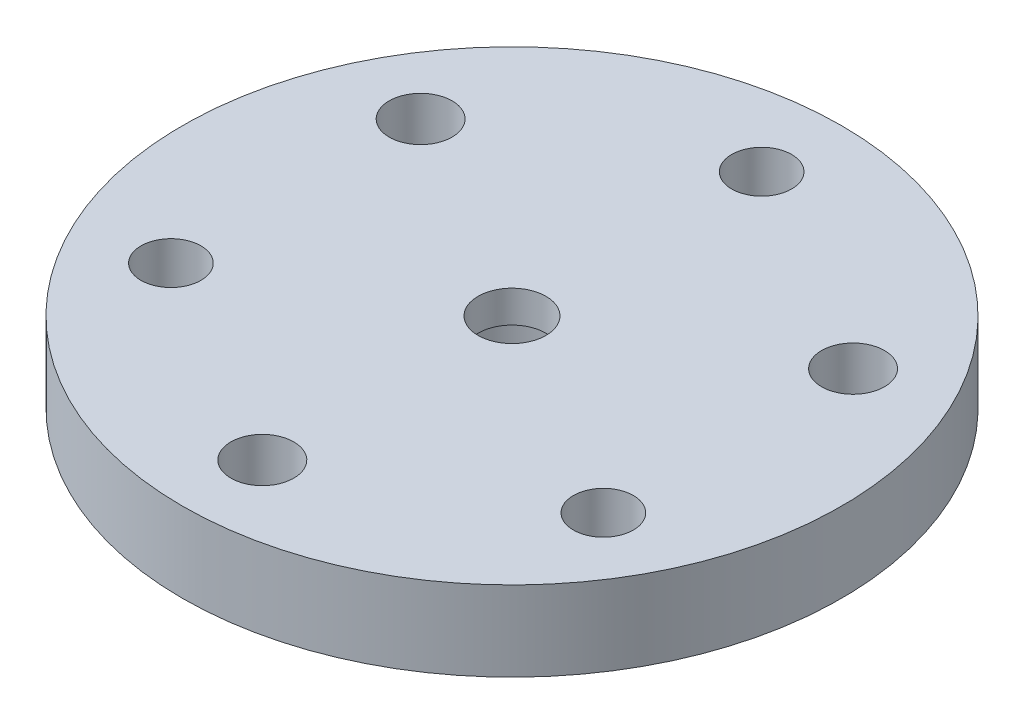
ISO-10303-21;
HEADER;
FILE_DESCRIPTION(('STEP AP214'),'2;1');
FILE_NAME('part.step','',(''),(''),'','','');
FILE_SCHEMA(('AUTOMOTIVE_DESIGN { 1 0 10303 214 1 1 1 1 }'));
ENDSEC;
DATA;
#1=APPLICATION_CONTEXT('core data for automotive mechanical design processes');
#2=APPLICATION_PROTOCOL_DEFINITION('international standard','automotive_design',2000,#1);
#3=PRODUCT_CONTEXT('',#1,'mechanical');
#4=PRODUCT('Part','Part','',(#3));
#5=PRODUCT_RELATED_PRODUCT_CATEGORY('part','',(#4));
#6=PRODUCT_DEFINITION_FORMATION('','',#4);
#7=PRODUCT_DEFINITION_CONTEXT('part definition',#1,'design');
#8=PRODUCT_DEFINITION('design','',#6,#7);
#9=PRODUCT_DEFINITION_SHAPE('','',#8);
#10=(LENGTH_UNIT() NAMED_UNIT(*) SI_UNIT(.MILLI.,.METRE.));
#11=(NAMED_UNIT(*) PLANE_ANGLE_UNIT() SI_UNIT($,.RADIAN.));
#12=(NAMED_UNIT(*) SI_UNIT($,.STERADIAN.) SOLID_ANGLE_UNIT());
#13=UNCERTAINTY_MEASURE_WITH_UNIT(LENGTH_MEASURE(1.E-05),#10,'distance_accuracy_value','');
#14=(GEOMETRIC_REPRESENTATION_CONTEXT(3) GLOBAL_UNCERTAINTY_ASSIGNED_CONTEXT((#13)) GLOBAL_UNIT_ASSIGNED_CONTEXT((#10,
#11,#12)) REPRESENTATION_CONTEXT('',''));
#15=CARTESIAN_POINT('',(0.,0.,0.));
#16=DIRECTION('',(0.,0.,1.));
#17=DIRECTION('',(1.,0.,0.));
#18=AXIS2_PLACEMENT_3D('',#15,#16,#17);
#19=CARTESIAN_POINT('',(0.,4.,0.));
#20=DIRECTION('',(0.,-1.,0.));
#21=DIRECTION('',(0.,0.,-1.));
#22=AXIS2_PLACEMENT_3D('',#19,#20,#21);
#23=CYLINDRICAL_SURFACE('',#22,16.5);
#24=CARTESIAN_POINT('',(0.,4.,0.));
#25=DIRECTION('',(0.,1.,0.));
#26=DIRECTION('',(0.,0.,1.));
#27=AXIS2_PLACEMENT_3D('',#24,#25,#26);
#28=CIRCLE('',#27,16.5);
#29=CARTESIAN_POINT('',(0.,4.,16.5));
#30=VERTEX_POINT('',#29);
#31=EDGE_CURVE('E10',#30,#30,#28,.T.);
#32=ORIENTED_EDGE('',*,*,#31,.F.);
#33=EDGE_LOOP('',(#32));
#34=FACE_BOUND('',#33,.T.);
#35=CARTESIAN_POINT('',(0.,0.,0.));
#36=DIRECTION('',(0.,1.,0.));
#37=DIRECTION('',(0.,0.,1.));
#38=AXIS2_PLACEMENT_3D('',#35,#36,#37);
#39=CIRCLE('',#38,16.5);
#40=CARTESIAN_POINT('',(0.,0.,16.5));
#41=VERTEX_POINT('',#40);
#42=EDGE_CURVE('E46',#41,#41,#39,.T.);
#43=ORIENTED_EDGE('',*,*,#42,.T.);
#44=EDGE_LOOP('',(#43));
#45=FACE_BOUND('',#44,.T.);
#46=ADVANCED_FACE('F43',(#34,#45),#23,.T.);
#47=CARTESIAN_POINT('',(0.,4.,0.));
#48=DIRECTION('',(0.,1.,0.));
#49=DIRECTION('',(0.,0.,1.));
#50=AXIS2_PLACEMENT_3D('',#47,#48,#49);
#51=PLANE('',#50);
#52=CARTESIAN_POINT('',(0.,4.,12.5));
#53=DIRECTION('',(0.,-1.,0.));
#54=DIRECTION('',(0.,0.,-1.));
#55=AXIS2_PLACEMENT_3D('',#52,#53,#54);
#56=CIRCLE('',#55,1.575);
#57=CARTESIAN_POINT('',(0.,4.,10.925));
#58=VERTEX_POINT('',#57);
#59=EDGE_CURVE('E112',#58,#58,#56,.T.);
#60=ORIENTED_EDGE('',*,*,#59,.T.);
#61=EDGE_LOOP('',(#60));
#62=FACE_BOUND('',#61,.T.);
#63=CARTESIAN_POINT('',(10.8253175473055,4.,-6.25000000000005));
#64=DIRECTION('',(0.,-1.,0.));
#65=DIRECTION('',(0.,0.,-1.));
#66=AXIS2_PLACEMENT_3D('',#63,#64,#65);
#67=CIRCLE('',#66,1.575);
#68=CARTESIAN_POINT('',(10.8253175473055,4.,-7.82500000000005));
#69=VERTEX_POINT('',#68);
#70=EDGE_CURVE('E104',#69,#69,#67,.T.);
#71=ORIENTED_EDGE('',*,*,#70,.T.);
#72=EDGE_LOOP('',(#71));
#73=FACE_BOUND('',#72,.T.);
#74=CARTESIAN_POINT('',(-10.8253175473055,4.,-6.2499999999999));
#75=DIRECTION('',(0.,-1.,0.));
#76=DIRECTION('',(0.,0.,-1.));
#77=AXIS2_PLACEMENT_3D('',#74,#75,#76);
#78=CIRCLE('',#77,1.575);
#79=CARTESIAN_POINT('',(-10.8253175473055,4.,-7.8249999999999));
#80=VERTEX_POINT('',#79);
#81=EDGE_CURVE('E96',#80,#80,#78,.T.);
#82=ORIENTED_EDGE('',*,*,#81,.T.);
#83=EDGE_LOOP('',(#82));
#84=FACE_BOUND('',#83,.T.);
#85=CARTESIAN_POINT('',(0.,4.,-12.5));
#86=DIRECTION('',(0.,1.,0.));
#87=DIRECTION('',(0.,0.,1.));
#88=AXIS2_PLACEMENT_3D('',#85,#86,#87);
#89=CIRCLE('',#88,1.5);
#90=CARTESIAN_POINT('',(0.,4.,-11.));
#91=VERTEX_POINT('',#90);
#92=EDGE_CURVE('E88',#91,#91,#89,.T.);
#93=ORIENTED_EDGE('',*,*,#92,.F.);
#94=EDGE_LOOP('',(#93));
#95=FACE_BOUND('',#94,.T.);
#96=CARTESIAN_POINT('',(-10.8253175473063,4.,6.24999999999954));
#97=DIRECTION('',(0.,1.,0.));
#98=DIRECTION('',(0.,0.,1.));
#99=AXIS2_PLACEMENT_3D('',#96,#97,#98);
#100=CIRCLE('',#99,1.5);
#101=CARTESIAN_POINT('',(-10.8253175473063,4.,7.74999999999954));
#102=VERTEX_POINT('',#101);
#103=EDGE_CURVE('E80',#102,#102,#100,.T.);
#104=ORIENTED_EDGE('',*,*,#103,.F.);
#105=EDGE_LOOP('',(#104));
#106=FACE_BOUND('',#105,.T.);
#107=CARTESIAN_POINT('',(10.8253175473047,4.,6.25000000000046));
#108=DIRECTION('',(0.,1.,0.));
#109=DIRECTION('',(0.,0.,1.));
#110=AXIS2_PLACEMENT_3D('',#107,#108,#109);
#111=CIRCLE('',#110,1.5);
#112=CARTESIAN_POINT('',(10.8253175473047,4.,7.75000000000046));
#113=VERTEX_POINT('',#112);
#114=EDGE_CURVE('E72',#113,#113,#111,.T.);
#115=ORIENTED_EDGE('',*,*,#114,.F.);
#116=EDGE_LOOP('',(#115));
#117=FACE_BOUND('',#116,.T.);
#118=CARTESIAN_POINT('',(0.,4.,0.));
#119=DIRECTION('',(0.,-1.,0.));
#120=DIRECTION('',(0.,0.,-1.));
#121=AXIS2_PLACEMENT_3D('',#118,#119,#120);
#122=CIRCLE('',#121,1.7);
#123=CARTESIAN_POINT('',(0.,4.,-1.7));
#124=VERTEX_POINT('',#123);
#125=EDGE_CURVE('E55',#124,#124,#122,.T.);
#126=ORIENTED_EDGE('',*,*,#125,.T.);
#127=EDGE_LOOP('',(#126));
#128=FACE_BOUND('',#127,.T.);
#129=ORIENTED_EDGE('',*,*,#31,.T.);
#130=EDGE_LOOP('',(#129));
#131=FACE_BOUND('',#130,.T.);
#132=ADVANCED_FACE('F127',(#62,#73,#84,#95,#106,#117,#128,#131),#51,.T.);
#133=CARTESIAN_POINT('',(0.,0.,0.));
#134=DIRECTION('',(0.,1.,0.));
#135=DIRECTION('',(0.,0.,1.));
#136=AXIS2_PLACEMENT_3D('',#133,#134,#135);
#137=PLANE('',#136);
#138=CARTESIAN_POINT('',(0.,0.,12.5));
#139=DIRECTION('',(0.,-1.,0.));
#140=DIRECTION('',(0.,0.,-1.));
#141=AXIS2_PLACEMENT_3D('',#138,#139,#140);
#142=CIRCLE('',#141,1.57499999999999);
#143=CARTESIAN_POINT('',(0.,0.,10.925));
#144=VERTEX_POINT('',#143);
#145=EDGE_CURVE('E116',#144,#144,#142,.T.);
#146=ORIENTED_EDGE('',*,*,#145,.F.);
#147=EDGE_LOOP('',(#146));
#148=FACE_BOUND('',#147,.T.);
#149=CARTESIAN_POINT('',(10.8253175473055,0.,-6.25000000000005));
#150=DIRECTION('',(0.,-1.,0.));
#151=DIRECTION('',(0.,0.,-1.));
#152=AXIS2_PLACEMENT_3D('',#149,#150,#151);
#153=CIRCLE('',#152,1.57499999999999);
#154=CARTESIAN_POINT('',(10.8253175473055,0.,-7.82500000000004));
#155=VERTEX_POINT('',#154);
#156=EDGE_CURVE('E108',#155,#155,#153,.T.);
#157=ORIENTED_EDGE('',*,*,#156,.F.);
#158=EDGE_LOOP('',(#157));
#159=FACE_BOUND('',#158,.T.);
#160=CARTESIAN_POINT('',(-10.8253175473055,0.,-6.2499999999999));
#161=DIRECTION('',(0.,-1.,0.));
#162=DIRECTION('',(0.,0.,-1.));
#163=AXIS2_PLACEMENT_3D('',#160,#161,#162);
#164=CIRCLE('',#163,1.57499999999999);
#165=CARTESIAN_POINT('',(-10.8253175473055,0.,-7.82499999999989));
#166=VERTEX_POINT('',#165);
#167=EDGE_CURVE('E100',#166,#166,#164,.T.);
#168=ORIENTED_EDGE('',*,*,#167,.F.);
#169=EDGE_LOOP('',(#168));
#170=FACE_BOUND('',#169,.T.);
#171=CARTESIAN_POINT('',(0.,0.,-12.5));
#172=DIRECTION('',(0.,-1.,0.));
#173=DIRECTION('',(0.,0.,-1.));
#174=AXIS2_PLACEMENT_3D('',#171,#172,#173);
#175=CIRCLE('',#174,1.5);
#176=CARTESIAN_POINT('',(0.,0.,-14.));
#177=VERTEX_POINT('',#176);
#178=EDGE_CURVE('E92',#177,#177,#175,.T.);
#179=ORIENTED_EDGE('',*,*,#178,.F.);
#180=EDGE_LOOP('',(#179));
#181=FACE_BOUND('',#180,.T.);
#182=CARTESIAN_POINT('',(-10.8253175473063,0.,6.24999999999954));
#183=DIRECTION('',(0.,-1.,0.));
#184=DIRECTION('',(0.,0.,-1.));
#185=AXIS2_PLACEMENT_3D('',#182,#183,#184);
#186=CIRCLE('',#185,1.5);
#187=CARTESIAN_POINT('',(-10.8253175473063,0.,4.74999999999954));
#188=VERTEX_POINT('',#187);
#189=EDGE_CURVE('E84',#188,#188,#186,.T.);
#190=ORIENTED_EDGE('',*,*,#189,.F.);
#191=EDGE_LOOP('',(#190));
#192=FACE_BOUND('',#191,.T.);
#193=CARTESIAN_POINT('',(10.8253175473047,0.,6.25000000000046));
#194=DIRECTION('',(0.,-1.,0.));
#195=DIRECTION('',(0.,0.,-1.));
#196=AXIS2_PLACEMENT_3D('',#193,#194,#195);
#197=CIRCLE('',#196,1.5);
#198=CARTESIAN_POINT('',(10.8253175473047,0.,4.75000000000046));
#199=VERTEX_POINT('',#198);
#200=EDGE_CURVE('E76',#199,#199,#197,.T.);
#201=ORIENTED_EDGE('',*,*,#200,.F.);
#202=EDGE_LOOP('',(#201));
#203=FACE_BOUND('',#202,.T.);
#204=CARTESIAN_POINT('',(0.,0.,0.));
#205=DIRECTION('',(0.,-1.,0.));
#206=DIRECTION('',(0.,0.,-1.));
#207=AXIS2_PLACEMENT_3D('',#204,#205,#206);
#208=CIRCLE('',#207,3.25);
#209=CARTESIAN_POINT('',(0.,0.,-3.25));
#210=VERTEX_POINT('',#209);
#211=EDGE_CURVE('E68',#210,#210,#208,.T.);
#212=ORIENTED_EDGE('',*,*,#211,.F.);
#213=EDGE_LOOP('',(#212));
#214=FACE_BOUND('',#213,.T.);
#215=ORIENTED_EDGE('',*,*,#42,.F.);
#216=EDGE_LOOP('',(#215));
#217=FACE_BOUND('',#216,.T.);
#218=ADVANCED_FACE('F123',(#148,#159,#170,#181,#192,#203,#214,#217),#137,.F.);
#219=CARTESIAN_POINT('',(0.,0.,0.));
#220=DIRECTION('',(0.,-1.,0.));
#221=DIRECTION('',(0.,0.,-1.));
#222=AXIS2_PLACEMENT_3D('',#219,#220,#221);
#223=CYLINDRICAL_SURFACE('',#222,1.7);
#224=ORIENTED_EDGE('',*,*,#125,.F.);
#225=EDGE_LOOP('',(#224));
#226=FACE_BOUND('',#225,.T.);
#227=CARTESIAN_POINT('',(0.,2.4,0.));
#228=DIRECTION('',(0.,-1.,0.));
#229=DIRECTION('',(0.,0.,-1.));
#230=AXIS2_PLACEMENT_3D('',#227,#228,#229);
#231=CIRCLE('',#230,1.7);
#232=CARTESIAN_POINT('',(0.,2.4,-1.7));
#233=VERTEX_POINT('',#232);
#234=EDGE_CURVE('E60',#233,#233,#231,.T.);
#235=ORIENTED_EDGE('',*,*,#234,.T.);
#236=EDGE_LOOP('',(#235));
#237=FACE_BOUND('',#236,.T.);
#238=ADVANCED_FACE('F126',(#226,#237),#223,.F.);
#239=CARTESIAN_POINT('',(1.7,2.4,0.));
#240=DIRECTION('',(0.,1.,0.));
#241=DIRECTION('',(0.,0.,1.));
#242=AXIS2_PLACEMENT_3D('',#239,#240,#241);
#243=PLANE('',#242);
#244=ORIENTED_EDGE('',*,*,#234,.F.);
#245=EDGE_LOOP('',(#244));
#246=FACE_BOUND('',#245,.T.);
#247=CARTESIAN_POINT('',(0.,2.4,0.));
#248=DIRECTION('',(0.,-1.,0.));
#249=DIRECTION('',(0.,0.,-1.));
#250=AXIS2_PLACEMENT_3D('',#247,#248,#249);
#251=CIRCLE('',#250,3.25);
#252=CARTESIAN_POINT('',(0.,2.4,-3.25));
#253=VERTEX_POINT('',#252);
#254=EDGE_CURVE('E64',#253,#253,#251,.T.);
#255=ORIENTED_EDGE('',*,*,#254,.T.);
#256=EDGE_LOOP('',(#255));
#257=FACE_BOUND('',#256,.T.);
#258=ADVANCED_FACE('F156',(#246,#257),#243,.F.);
#259=CARTESIAN_POINT('',(0.,0.,0.));
#260=DIRECTION('',(0.,-1.,0.));
#261=DIRECTION('',(0.,0.,-1.));
#262=AXIS2_PLACEMENT_3D('',#259,#260,#261);
#263=CYLINDRICAL_SURFACE('',#262,3.25);
#264=ORIENTED_EDGE('',*,*,#254,.F.);
#265=EDGE_LOOP('',(#264));
#266=FACE_BOUND('',#265,.T.);
#267=ORIENTED_EDGE('',*,*,#211,.T.);
#268=EDGE_LOOP('',(#267));
#269=FACE_BOUND('',#268,.T.);
#270=ADVANCED_FACE('F160',(#266,#269),#263,.F.);
#271=CARTESIAN_POINT('',(10.8253175473047,0.,6.25000000000046));
#272=DIRECTION('',(0.,-1.,0.));
#273=DIRECTION('',(0.,0.,-1.));
#274=AXIS2_PLACEMENT_3D('',#271,#272,#273);
#275=CYLINDRICAL_SURFACE('',#274,1.5);
#276=ORIENTED_EDGE('',*,*,#114,.T.);
#277=EDGE_LOOP('',(#276));
#278=FACE_BOUND('',#277,.T.);
#279=ORIENTED_EDGE('',*,*,#200,.T.);
#280=EDGE_LOOP('',(#279));
#281=FACE_BOUND('',#280,.T.);
#282=ADVANCED_FACE('F164',(#278,#281),#275,.F.);
#283=CARTESIAN_POINT('',(-10.8253175473063,0.,6.24999999999954));
#284=DIRECTION('',(0.,-1.,0.));
#285=DIRECTION('',(0.,0.,-1.));
#286=AXIS2_PLACEMENT_3D('',#283,#284,#285);
#287=CYLINDRICAL_SURFACE('',#286,1.5);
#288=ORIENTED_EDGE('',*,*,#103,.T.);
#289=EDGE_LOOP('',(#288));
#290=FACE_BOUND('',#289,.T.);
#291=ORIENTED_EDGE('',*,*,#189,.T.);
#292=EDGE_LOOP('',(#291));
#293=FACE_BOUND('',#292,.T.);
#294=ADVANCED_FACE('F168',(#290,#293),#287,.F.);
#295=CARTESIAN_POINT('',(0.,0.,-12.5));
#296=DIRECTION('',(0.,-1.,0.));
#297=DIRECTION('',(0.,0.,-1.));
#298=AXIS2_PLACEMENT_3D('',#295,#296,#297);
#299=CYLINDRICAL_SURFACE('',#298,1.5);
#300=ORIENTED_EDGE('',*,*,#92,.T.);
#301=EDGE_LOOP('',(#300));
#302=FACE_BOUND('',#301,.T.);
#303=ORIENTED_EDGE('',*,*,#178,.T.);
#304=EDGE_LOOP('',(#303));
#305=FACE_BOUND('',#304,.T.);
#306=ADVANCED_FACE('F172',(#302,#305),#299,.F.);
#307=CARTESIAN_POINT('',(-10.8253175473055,0.,-6.2499999999999));
#308=DIRECTION('',(0.,-1.,0.));
#309=DIRECTION('',(0.,0.,-1.));
#310=AXIS2_PLACEMENT_3D('',#307,#308,#309);
#311=CYLINDRICAL_SURFACE('',#310,1.57499999999999);
#312=ORIENTED_EDGE('',*,*,#81,.F.);
#313=EDGE_LOOP('',(#312));
#314=FACE_BOUND('',#313,.T.);
#315=ORIENTED_EDGE('',*,*,#167,.T.);
#316=EDGE_LOOP('',(#315));
#317=FACE_BOUND('',#316,.T.);
#318=ADVANCED_FACE('F175',(#314,#317),#311,.F.);
#319=CARTESIAN_POINT('',(10.8253175473055,0.,-6.25000000000005));
#320=DIRECTION('',(0.,-1.,0.));
#321=DIRECTION('',(0.,0.,-1.));
#322=AXIS2_PLACEMENT_3D('',#319,#320,#321);
#323=CYLINDRICAL_SURFACE('',#322,1.57499999999999);
#324=ORIENTED_EDGE('',*,*,#70,.F.);
#325=EDGE_LOOP('',(#324));
#326=FACE_BOUND('',#325,.T.);
#327=ORIENTED_EDGE('',*,*,#156,.T.);
#328=EDGE_LOOP('',(#327));
#329=FACE_BOUND('',#328,.T.);
#330=ADVANCED_FACE('F179',(#326,#329),#323,.F.);
#331=CARTESIAN_POINT('',(0.,0.,12.5));
#332=DIRECTION('',(0.,-1.,0.));
#333=DIRECTION('',(0.,0.,-1.));
#334=AXIS2_PLACEMENT_3D('',#331,#332,#333);
#335=CYLINDRICAL_SURFACE('',#334,1.57499999999999);
#336=ORIENTED_EDGE('',*,*,#59,.F.);
#337=EDGE_LOOP('',(#336));
#338=FACE_BOUND('',#337,.T.);
#339=ORIENTED_EDGE('',*,*,#145,.T.);
#340=EDGE_LOOP('',(#339));
#341=FACE_BOUND('',#340,.T.);
#342=ADVANCED_FACE('F121',(#338,#341),#335,.F.);
#343=CLOSED_SHELL('',(#46,#132,#218,#238,#258,#270,#282,#294,#306,#318,#330,#342));
#344=MANIFOLD_SOLID_BREP('B2',#343);
#345=ADVANCED_BREP_SHAPE_REPRESENTATION('',(#18,#344),#14);
#346=SHAPE_DEFINITION_REPRESENTATION(#9,#345);
ENDSEC;
END-ISO-10303-21;
